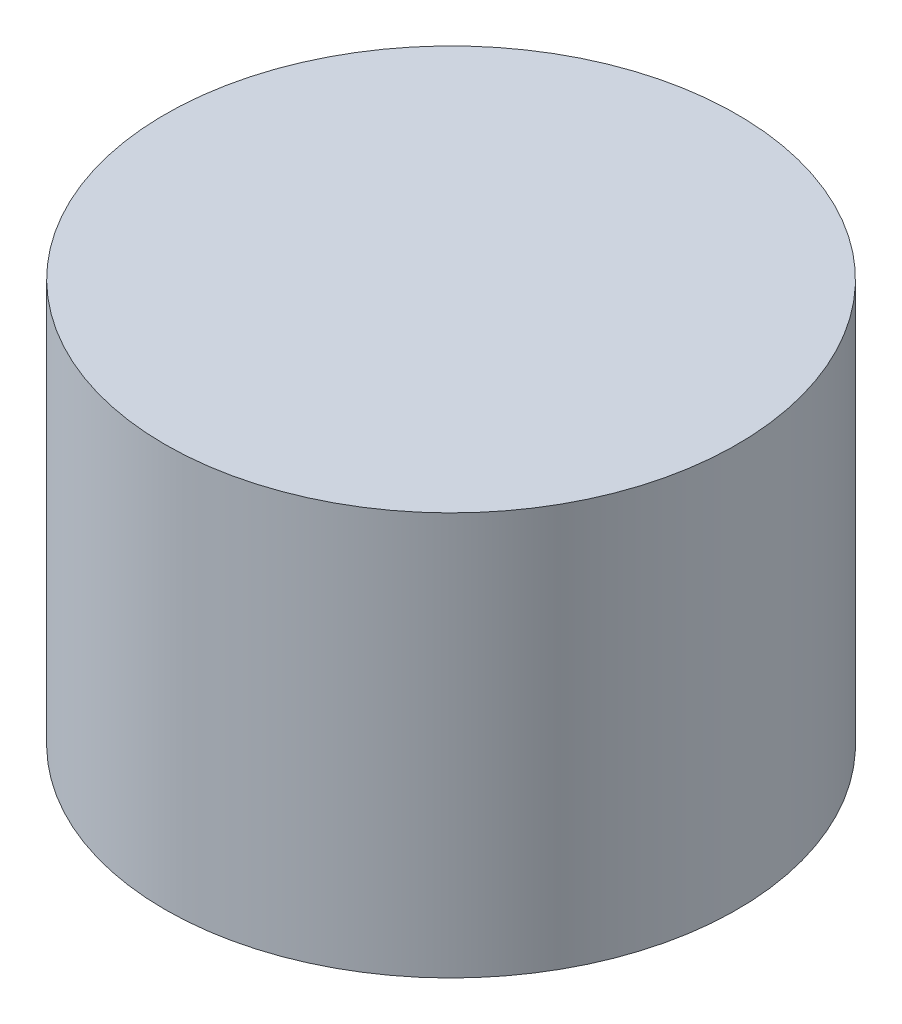
ISO-10303-21;
HEADER;
FILE_DESCRIPTION(('STEP AP214'),'2;1');
FILE_NAME('part.step','',(''),(''),'','','');
FILE_SCHEMA(('AUTOMOTIVE_DESIGN { 1 0 10303 214 1 1 1 1 }'));
ENDSEC;
DATA;
#1=APPLICATION_CONTEXT('core data for automotive mechanical design processes');
#2=APPLICATION_PROTOCOL_DEFINITION('international standard','automotive_design',2000,#1);
#3=PRODUCT_CONTEXT('',#1,'mechanical');
#4=PRODUCT('Part','Part','',(#3));
#5=PRODUCT_RELATED_PRODUCT_CATEGORY('part','',(#4));
#6=PRODUCT_DEFINITION_FORMATION('','',#4);
#7=PRODUCT_DEFINITION_CONTEXT('part definition',#1,'design');
#8=PRODUCT_DEFINITION('design','',#6,#7);
#9=PRODUCT_DEFINITION_SHAPE('','',#8);
#10=(LENGTH_UNIT() NAMED_UNIT(*) SI_UNIT(.MILLI.,.METRE.));
#11=(NAMED_UNIT(*) PLANE_ANGLE_UNIT() SI_UNIT($,.RADIAN.));
#12=(NAMED_UNIT(*) SI_UNIT($,.STERADIAN.) SOLID_ANGLE_UNIT());
#13=UNCERTAINTY_MEASURE_WITH_UNIT(LENGTH_MEASURE(1.E-05),#10,'distance_accuracy_value','');
#14=(GEOMETRIC_REPRESENTATION_CONTEXT(3) GLOBAL_UNCERTAINTY_ASSIGNED_CONTEXT((#13)) GLOBAL_UNIT_ASSIGNED_CONTEXT((#10,
#11,#12)) REPRESENTATION_CONTEXT('',''));
#15=CARTESIAN_POINT('',(0.,0.,0.));
#16=DIRECTION('',(0.,0.,1.));
#17=DIRECTION('',(1.,0.,0.));
#18=AXIS2_PLACEMENT_3D('',#15,#16,#17);
#19=CARTESIAN_POINT('',(0.,10.,0.));
#20=DIRECTION('',(0.,-1.,0.));
#21=DIRECTION('',(0.,0.,-1.));
#22=AXIS2_PLACEMENT_3D('',#19,#20,#21);
#23=CYLINDRICAL_SURFACE('',#22,7.1);
#24=CARTESIAN_POINT('',(0.,10.,0.));
#25=DIRECTION('',(0.,1.,0.));
#26=DIRECTION('',(0.,0.,1.));
#27=AXIS2_PLACEMENT_3D('',#24,#25,#26);
#28=CIRCLE('',#27,7.1);
#29=CARTESIAN_POINT('',(0.,10.,7.1));
#30=VERTEX_POINT('',#29);
#31=EDGE_CURVE('E10',#30,#30,#28,.T.);
#32=ORIENTED_EDGE('',*,*,#31,.F.);
#33=EDGE_LOOP('',(#32));
#34=FACE_BOUND('',#33,.T.);
#35=CARTESIAN_POINT('',(0.,0.,0.));
#36=DIRECTION('',(0.,1.,0.));
#37=DIRECTION('',(0.,0.,1.));
#38=AXIS2_PLACEMENT_3D('',#35,#36,#37);
#39=CIRCLE('',#38,7.1);
#40=CARTESIAN_POINT('',(0.,0.,7.1));
#41=VERTEX_POINT('',#40);
#42=EDGE_CURVE('E39',#41,#41,#39,.T.);
#43=ORIENTED_EDGE('',*,*,#42,.T.);
#44=EDGE_LOOP('',(#43));
#45=FACE_BOUND('',#44,.T.);
#46=ADVANCED_FACE('F36',(#34,#45),#23,.T.);
#47=CARTESIAN_POINT('',(0.,10.,0.));
#48=DIRECTION('',(0.,1.,0.));
#49=DIRECTION('',(0.,0.,1.));
#50=AXIS2_PLACEMENT_3D('',#47,#48,#49);
#51=PLANE('',#50);
#52=ORIENTED_EDGE('',*,*,#31,.T.);
#53=EDGE_LOOP('',(#52));
#54=FACE_BOUND('',#53,.T.);
#55=ADVANCED_FACE('F51',(#54),#51,.T.);
#56=CARTESIAN_POINT('',(0.,0.,0.));
#57=DIRECTION('',(0.,1.,0.));
#58=DIRECTION('',(0.,0.,1.));
#59=AXIS2_PLACEMENT_3D('',#56,#57,#58);
#60=PLANE('',#59);
#61=ORIENTED_EDGE('',*,*,#42,.F.);
#62=EDGE_LOOP('',(#61));
#63=FACE_BOUND('',#62,.T.);
#64=ADVANCED_FACE('F49',(#63),#60,.F.);
#65=CLOSED_SHELL('',(#46,#55,#64));
#66=MANIFOLD_SOLID_BREP('B2',#65);
#67=ADVANCED_BREP_SHAPE_REPRESENTATION('',(#18,#66),#14);
#68=SHAPE_DEFINITION_REPRESENTATION(#9,#67);
ENDSEC;
END-ISO-10303-21;
